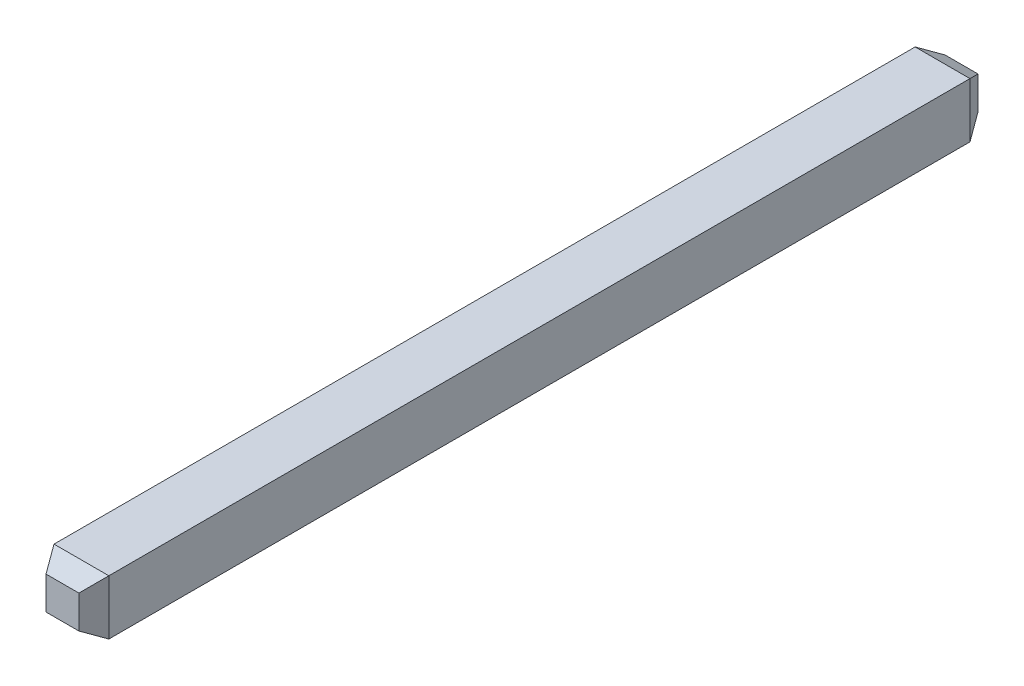
ISO-10303-21;
HEADER;
FILE_DESCRIPTION(('STEP AP214'),'2;1');
FILE_NAME('part.step','',(''),(''),'','','');
FILE_SCHEMA(('AUTOMOTIVE_DESIGN { 1 0 10303 214 1 1 1 1 }'));
ENDSEC;
DATA;
#1=APPLICATION_CONTEXT('core data for automotive mechanical design processes');
#2=APPLICATION_PROTOCOL_DEFINITION('international standard','automotive_design',2000,#1);
#3=PRODUCT_CONTEXT('',#1,'mechanical');
#4=PRODUCT('Part','Part','',(#3));
#5=PRODUCT_RELATED_PRODUCT_CATEGORY('part','',(#4));
#6=PRODUCT_DEFINITION_FORMATION('','',#4);
#7=PRODUCT_DEFINITION_CONTEXT('part definition',#1,'design');
#8=PRODUCT_DEFINITION('design','',#6,#7);
#9=PRODUCT_DEFINITION_SHAPE('','',#8);
#10=(LENGTH_UNIT() NAMED_UNIT(*) SI_UNIT(.MILLI.,.METRE.));
#11=(NAMED_UNIT(*) PLANE_ANGLE_UNIT() SI_UNIT($,.RADIAN.));
#12=(NAMED_UNIT(*) SI_UNIT($,.STERADIAN.) SOLID_ANGLE_UNIT());
#13=UNCERTAINTY_MEASURE_WITH_UNIT(LENGTH_MEASURE(1.E-05),#10,'distance_accuracy_value','');
#14=(GEOMETRIC_REPRESENTATION_CONTEXT(3) GLOBAL_UNCERTAINTY_ASSIGNED_CONTEXT((#13)) GLOBAL_UNIT_ASSIGNED_CONTEXT((#10,
#11,#12)) REPRESENTATION_CONTEXT('',''));
#15=CARTESIAN_POINT('',(0.,0.,0.));
#16=DIRECTION('',(0.,0.,1.));
#17=DIRECTION('',(1.,0.,0.));
#18=AXIS2_PLACEMENT_3D('',#15,#16,#17);
#19=CARTESIAN_POINT('',(0.,-0.2,0.08660254037844));
#20=DIRECTION('',(0.,-0.866025403784429,-0.500000000000017));
#21=DIRECTION('',(0.,0.500000000000017,-0.866025403784429));
#22=AXIS2_PLACEMENT_3D('',#19,#20,#21);
#23=PLANE('',#22);
#24=DIRECTION('',(-0.447213595499978,-0.447213595499939,0.774596669241483));
#25=VECTOR('',#24,1.);
#26=CARTESIAN_POINT('',(-0.15,-0.15,0.));
#27=LINE('',#26,#25);
#28=CARTESIAN_POINT('',(-0.15,-0.15,0.));
#29=VERTEX_POINT('',#28);
#30=CARTESIAN_POINT('',(-0.250000000000002,-0.250000000000004,0.173205080756896));
#31=VERTEX_POINT('',#30);
#32=EDGE_CURVE('E84',#29,#31,#27,.T.);
#33=ORIENTED_EDGE('',*,*,#32,.F.);
#34=DIRECTION('',(1.,0.,0.));
#35=VECTOR('',#34,1.);
#36=CARTESIAN_POINT('',(0.,-0.15,0.));
#37=LINE('',#36,#35);
#38=CARTESIAN_POINT('',(0.15,-0.15,0.));
#39=VERTEX_POINT('',#38);
#40=EDGE_CURVE('E78',#29,#39,#37,.T.);
#41=ORIENTED_EDGE('',*,*,#40,.T.);
#42=DIRECTION('',(-0.447213595499978,0.447213595499939,-0.774596669241483));
#43=VECTOR('',#42,1.);
#44=CARTESIAN_POINT('',(0.250000000000009,-0.25,0.173205080756895));
#45=LINE('',#44,#43);
#46=CARTESIAN_POINT('',(0.250000000000001,-0.250000000000004,0.173205080756897));
#47=VERTEX_POINT('',#46);
#48=EDGE_CURVE('E19',#47,#39,#45,.T.);
#49=ORIENTED_EDGE('',*,*,#48,.F.);
#50=DIRECTION('',(1.,0.,0.));
#51=VECTOR('',#50,1.);
#52=CARTESIAN_POINT('',(-0.25,-0.25,0.1732050807569));
#53=LINE('',#52,#51);
#54=EDGE_CURVE('E103',#31,#47,#53,.T.);
#55=ORIENTED_EDGE('',*,*,#54,.F.);
#56=EDGE_LOOP('',(#33,#41,#49,#55));
#57=FACE_BOUND('',#56,.T.);
#58=ADVANCED_FACE('F16',(#57),#23,.T.);
#59=CARTESIAN_POINT('',(0.,-0.2,8.113397459622));
#60=DIRECTION('',(0.,-0.866025403784429,0.500000000000017));
#61=DIRECTION('',(0.,-0.500000000000017,-0.866025403784429));
#62=AXIS2_PLACEMENT_3D('',#59,#60,#61);
#63=PLANE('',#62);
#64=DIRECTION('',(0.447213595500016,0.447213595499785,0.77459666924155));
#65=VECTOR('',#64,1.);
#66=CARTESIAN_POINT('',(-0.250000000000242,-0.25,8.02679491924314));
#67=LINE('',#66,#65);
#68=CARTESIAN_POINT('',(-0.25000000000003,-0.250000000000121,8.02679491924309));
#69=VERTEX_POINT('',#68);
#70=CARTESIAN_POINT('',(-0.150000000000095,-0.150000000000048,8.20000000000008));
#71=VERTEX_POINT('',#70);
#72=EDGE_CURVE('E111',#69,#71,#67,.T.);
#73=ORIENTED_EDGE('',*,*,#72,.F.);
#74=DIRECTION('',(1.,0.,0.));
#75=VECTOR('',#74,1.);
#76=CARTESIAN_POINT('',(-0.25,-0.25,8.026794919243));
#77=LINE('',#76,#75);
#78=CARTESIAN_POINT('',(0.25000000000003,-0.250000000000121,8.02679491924309));
#79=VERTEX_POINT('',#78);
#80=EDGE_CURVE('E105',#79,#69,#77,.F.);
#81=ORIENTED_EDGE('',*,*,#80,.F.);
#82=DIRECTION('',(0.447213595500016,-0.447213595499785,-0.77459666924155));
#83=VECTOR('',#82,1.);
#84=CARTESIAN_POINT('',(0.150000000000191,-0.15,8.20000000000011));
#85=LINE('',#84,#83);
#86=CARTESIAN_POINT('',(0.150000000000048,-0.150000000000095,8.20000000000008));
#87=VERTEX_POINT('',#86);
#88=EDGE_CURVE('E108',#87,#79,#85,.T.);
#89=ORIENTED_EDGE('',*,*,#88,.F.);
#90=DIRECTION('',(1.,0.,0.));
#91=VECTOR('',#90,1.);
#92=CARTESIAN_POINT('',(0.,-0.15,8.2));
#93=LINE('',#92,#91);
#94=EDGE_CURVE('E116',#71,#87,#93,.T.);
#95=ORIENTED_EDGE('',*,*,#94,.F.);
#96=EDGE_LOOP('',(#73,#81,#89,#95));
#97=FACE_BOUND('',#96,.T.);
#98=ADVANCED_FACE('F175',(#97),#63,.T.);
#99=CARTESIAN_POINT('',(0.2,0.,0.08660254037844));
#100=DIRECTION('',(0.866025403784429,0.,-0.500000000000017));
#101=DIRECTION('',(-0.500000000000017,0.,-0.866025403784429));
#102=AXIS2_PLACEMENT_3D('',#99,#100,#101);
#103=PLANE('',#102);
#104=ORIENTED_EDGE('',*,*,#48,.T.);
#105=DIRECTION('',(0.,1.,0.));
#106=VECTOR('',#105,1.);
#107=CARTESIAN_POINT('',(0.15,0.,0.));
#108=LINE('',#107,#106);
#109=CARTESIAN_POINT('',(0.15,0.15,0.));
#110=VERTEX_POINT('',#109);
#111=EDGE_CURVE('E86',#39,#110,#108,.T.);
#112=ORIENTED_EDGE('',*,*,#111,.T.);
#113=DIRECTION('',(-0.447213595499939,-0.447213595499978,-0.774596669241483));
#114=VECTOR('',#113,1.);
#115=CARTESIAN_POINT('',(0.25,0.250000000000009,0.173205080756895));
#116=LINE('',#115,#114);
#117=CARTESIAN_POINT('',(0.250000000000004,0.250000000000001,0.173205080756897));
#118=VERTEX_POINT('',#117);
#119=EDGE_CURVE('E128',#118,#110,#116,.T.);
#120=ORIENTED_EDGE('',*,*,#119,.F.);
#121=DIRECTION('',(0.,1.,0.));
#122=VECTOR('',#121,1.);
#123=CARTESIAN_POINT('',(0.25,-0.25,0.1732050807569));
#124=LINE('',#123,#122);
#125=EDGE_CURVE('E92',#47,#118,#124,.T.);
#126=ORIENTED_EDGE('',*,*,#125,.F.);
#127=EDGE_LOOP('',(#104,#112,#120,#126));
#128=FACE_BOUND('',#127,.T.);
#129=ADVANCED_FACE('F89',(#128),#103,.T.);
#130=CARTESIAN_POINT('',(0.,0.,0.));
#131=DIRECTION('',(0.,0.,1.));
#132=DIRECTION('',(1.,0.,0.));
#133=AXIS2_PLACEMENT_3D('',#130,#131,#132);
#134=PLANE('',#133);
#135=ORIENTED_EDGE('',*,*,#40,.F.);
#136=DIRECTION('',(0.,1.,0.));
#137=VECTOR('',#136,1.);
#138=CARTESIAN_POINT('',(-0.15,0.,0.));
#139=LINE('',#138,#137);
#140=CARTESIAN_POINT('',(-0.15,0.15,0.));
#141=VERTEX_POINT('',#140);
#142=EDGE_CURVE('E98',#141,#29,#139,.F.);
#143=ORIENTED_EDGE('',*,*,#142,.F.);
#144=DIRECTION('',(1.,0.,0.));
#145=VECTOR('',#144,1.);
#146=CARTESIAN_POINT('',(0.,0.15,0.));
#147=LINE('',#146,#145);
#148=EDGE_CURVE('E96',#110,#141,#147,.F.);
#149=ORIENTED_EDGE('',*,*,#148,.F.);
#150=ORIENTED_EDGE('',*,*,#111,.F.);
#151=EDGE_LOOP('',(#135,#143,#149,#150));
#152=FACE_BOUND('',#151,.T.);
#153=ADVANCED_FACE('F94',(#152),#134,.F.);
#154=CARTESIAN_POINT('',(-0.2,0.,0.08660254037844));
#155=DIRECTION('',(-0.866025403784429,0.,-0.500000000000017));
#156=DIRECTION('',(-0.500000000000017,0.,0.866025403784429));
#157=AXIS2_PLACEMENT_3D('',#154,#155,#156);
#158=PLANE('',#157);
#159=ORIENTED_EDGE('',*,*,#32,.T.);
#160=DIRECTION('',(0.,1.,0.));
#161=VECTOR('',#160,1.);
#162=CARTESIAN_POINT('',(-0.25,0.25,0.1732050807569));
#163=LINE('',#162,#161);
#164=CARTESIAN_POINT('',(-0.250000000000004,0.250000000000002,0.173205080756896));
#165=VERTEX_POINT('',#164);
#166=EDGE_CURVE('E134',#165,#31,#163,.F.);
#167=ORIENTED_EDGE('',*,*,#166,.F.);
#168=DIRECTION('',(-0.447213595499939,0.447213595499978,0.774596669241483));
#169=VECTOR('',#168,1.);
#170=CARTESIAN_POINT('',(-0.15,0.15,0.));
#171=LINE('',#170,#169);
#172=EDGE_CURVE('E131',#141,#165,#171,.T.);
#173=ORIENTED_EDGE('',*,*,#172,.F.);
#174=ORIENTED_EDGE('',*,*,#142,.T.);
#175=EDGE_LOOP('',(#159,#167,#173,#174));
#176=FACE_BOUND('',#175,.T.);
#177=ADVANCED_FACE('F183',(#176),#158,.T.);
#178=CARTESIAN_POINT('',(-0.25,-0.25,0.));
#179=DIRECTION('',(0.,-1.,0.));
#180=DIRECTION('',(0.,0.,-1.));
#181=AXIS2_PLACEMENT_3D('',#178,#179,#180);
#182=PLANE('',#181);
#183=DIRECTION('',(0.,0.,-1.));
#184=VECTOR('',#183,1.);
#185=CARTESIAN_POINT('',(0.25,-0.25,0.));
#186=LINE('',#185,#184);
#187=EDGE_CURVE('E122',#79,#47,#186,.T.);
#188=ORIENTED_EDGE('',*,*,#187,.F.);
#189=ORIENTED_EDGE('',*,*,#80,.T.);
#190=DIRECTION('',(0.,0.,1.));
#191=VECTOR('',#190,1.);
#192=CARTESIAN_POINT('',(-0.25,-0.25,0.));
#193=LINE('',#192,#191);
#194=EDGE_CURVE('E137',#31,#69,#193,.T.);
#195=ORIENTED_EDGE('',*,*,#194,.F.);
#196=ORIENTED_EDGE('',*,*,#54,.T.);
#197=EDGE_LOOP('',(#188,#189,#195,#196));
#198=FACE_BOUND('',#197,.T.);
#199=ADVANCED_FACE('F185',(#198),#182,.T.);
#200=CARTESIAN_POINT('',(0.2,0.,8.113397459622));
#201=DIRECTION('',(0.866025403784429,0.,0.500000000000017));
#202=DIRECTION('',(0.500000000000017,0.,-0.866025403784429));
#203=AXIS2_PLACEMENT_3D('',#200,#201,#202);
#204=PLANE('',#203);
#205=ORIENTED_EDGE('',*,*,#88,.T.);
#206=DIRECTION('',(0.,1.,0.));
#207=VECTOR('',#206,1.);
#208=CARTESIAN_POINT('',(0.25,-0.25,8.026794919243));
#209=LINE('',#208,#207);
#210=CARTESIAN_POINT('',(0.250000000000121,0.25000000000003,8.02679491924309));
#211=VERTEX_POINT('',#210);
#212=EDGE_CURVE('E125',#211,#79,#209,.F.);
#213=ORIENTED_EDGE('',*,*,#212,.F.);
#214=DIRECTION('',(0.447213595499785,0.447213595500016,-0.77459666924155));
#215=VECTOR('',#214,1.);
#216=CARTESIAN_POINT('',(0.15,0.150000000000191,8.20000000000011));
#217=LINE('',#216,#215);
#218=CARTESIAN_POINT('',(0.150000000000095,0.150000000000048,8.20000000000008));
#219=VERTEX_POINT('',#218);
#220=EDGE_CURVE('E142',#219,#211,#217,.T.);
#221=ORIENTED_EDGE('',*,*,#220,.F.);
#222=DIRECTION('',(0.,1.,0.));
#223=VECTOR('',#222,1.);
#224=CARTESIAN_POINT('',(0.15,0.,8.2));
#225=LINE('',#224,#223);
#226=EDGE_CURVE('E119',#87,#219,#225,.T.);
#227=ORIENTED_EDGE('',*,*,#226,.F.);
#228=EDGE_LOOP('',(#205,#213,#221,#227));
#229=FACE_BOUND('',#228,.T.);
#230=ADVANCED_FACE('F169',(#229),#204,.T.);
#231=CARTESIAN_POINT('',(-0.2,0.,8.113397459622));
#232=DIRECTION('',(-0.866025403784429,0.,0.500000000000017));
#233=DIRECTION('',(0.500000000000017,0.,0.866025403784429));
#234=AXIS2_PLACEMENT_3D('',#231,#232,#233);
#235=PLANE('',#234);
#236=DIRECTION('',(0.447213595499785,-0.447213595500016,0.77459666924155));
#237=VECTOR('',#236,1.);
#238=CARTESIAN_POINT('',(-0.25,0.250000000000242,8.02679491924314));
#239=LINE('',#238,#237);
#240=CARTESIAN_POINT('',(-0.250000000000121,0.25000000000003,8.02679491924309));
#241=VERTEX_POINT('',#240);
#242=CARTESIAN_POINT('',(-0.150000000000095,0.150000000000048,8.20000000000008));
#243=VERTEX_POINT('',#242);
#244=EDGE_CURVE('E34',#241,#243,#239,.T.);
#245=ORIENTED_EDGE('',*,*,#244,.F.);
#246=DIRECTION('',(0.,1.,0.));
#247=VECTOR('',#246,1.);
#248=CARTESIAN_POINT('',(-0.25,0.25,8.026794919243));
#249=LINE('',#248,#247);
#250=EDGE_CURVE('E140',#69,#241,#249,.T.);
#251=ORIENTED_EDGE('',*,*,#250,.F.);
#252=ORIENTED_EDGE('',*,*,#72,.T.);
#253=DIRECTION('',(0.,1.,0.));
#254=VECTOR('',#253,1.);
#255=CARTESIAN_POINT('',(-0.15,0.,8.2));
#256=LINE('',#255,#254);
#257=EDGE_CURVE('E113',#243,#71,#256,.F.);
#258=ORIENTED_EDGE('',*,*,#257,.F.);
#259=EDGE_LOOP('',(#245,#251,#252,#258));
#260=FACE_BOUND('',#259,.T.);
#261=ADVANCED_FACE('F193',(#260),#235,.T.);
#262=CARTESIAN_POINT('',(0.,0.,8.2));
#263=DIRECTION('',(0.,0.,1.));
#264=DIRECTION('',(1.,0.,0.));
#265=AXIS2_PLACEMENT_3D('',#262,#263,#264);
#266=PLANE('',#265);
#267=ORIENTED_EDGE('',*,*,#226,.T.);
#268=DIRECTION('',(1.,0.,0.));
#269=VECTOR('',#268,1.);
#270=CARTESIAN_POINT('',(0.,0.150000000000191,8.20000000000011));
#271=LINE('',#270,#269);
#272=EDGE_CURVE('E146',#243,#219,#271,.T.);
#273=ORIENTED_EDGE('',*,*,#272,.F.);
#274=ORIENTED_EDGE('',*,*,#257,.T.);
#275=ORIENTED_EDGE('',*,*,#94,.T.);
#276=EDGE_LOOP('',(#267,#273,#274,#275));
#277=FACE_BOUND('',#276,.T.);
#278=ADVANCED_FACE('F172',(#277),#266,.T.);
#279=CARTESIAN_POINT('',(0.25,-0.25,0.));
#280=DIRECTION('',(1.,0.,0.));
#281=DIRECTION('',(0.,0.,-1.));
#282=AXIS2_PLACEMENT_3D('',#279,#280,#281);
#283=PLANE('',#282);
#284=DIRECTION('',(0.,0.,1.));
#285=VECTOR('',#284,1.);
#286=CARTESIAN_POINT('',(0.25,0.25,0.));
#287=LINE('',#286,#285);
#288=EDGE_CURVE('E149',#211,#118,#287,.F.);
#289=ORIENTED_EDGE('',*,*,#288,.F.);
#290=ORIENTED_EDGE('',*,*,#212,.T.);
#291=ORIENTED_EDGE('',*,*,#187,.T.);
#292=ORIENTED_EDGE('',*,*,#125,.T.);
#293=EDGE_LOOP('',(#289,#290,#291,#292));
#294=FACE_BOUND('',#293,.T.);
#295=ADVANCED_FACE('F178',(#294),#283,.T.);
#296=CARTESIAN_POINT('',(0.,0.2,0.08660254037844));
#297=DIRECTION('',(0.,0.866025403784429,-0.500000000000017));
#298=DIRECTION('',(0.,0.500000000000017,0.866025403784429));
#299=AXIS2_PLACEMENT_3D('',#296,#297,#298);
#300=PLANE('',#299);
#301=ORIENTED_EDGE('',*,*,#172,.T.);
#302=DIRECTION('',(1.,0.,0.));
#303=VECTOR('',#302,1.);
#304=CARTESIAN_POINT('',(0.25,0.25,0.1732050807569));
#305=LINE('',#304,#303);
#306=EDGE_CURVE('E152',#118,#165,#305,.F.);
#307=ORIENTED_EDGE('',*,*,#306,.F.);
#308=ORIENTED_EDGE('',*,*,#119,.T.);
#309=ORIENTED_EDGE('',*,*,#148,.T.);
#310=EDGE_LOOP('',(#301,#307,#308,#309));
#311=FACE_BOUND('',#310,.T.);
#312=ADVANCED_FACE('F180',(#311),#300,.T.);
#313=CARTESIAN_POINT('',(-0.25,0.25,0.));
#314=DIRECTION('',(-1.,0.,0.));
#315=DIRECTION('',(0.,0.,1.));
#316=AXIS2_PLACEMENT_3D('',#313,#314,#315);
#317=PLANE('',#316);
#318=ORIENTED_EDGE('',*,*,#194,.T.);
#319=ORIENTED_EDGE('',*,*,#250,.T.);
#320=DIRECTION('',(0.,0.,1.));
#321=VECTOR('',#320,1.);
#322=CARTESIAN_POINT('',(-0.25,0.25,0.));
#323=LINE('',#322,#321);
#324=EDGE_CURVE('E25',#165,#241,#323,.T.);
#325=ORIENTED_EDGE('',*,*,#324,.F.);
#326=ORIENTED_EDGE('',*,*,#166,.T.);
#327=EDGE_LOOP('',(#318,#319,#325,#326));
#328=FACE_BOUND('',#327,.T.);
#329=ADVANCED_FACE('F162',(#328),#317,.T.);
#330=CARTESIAN_POINT('',(0.,0.2,8.113397459622));
#331=DIRECTION('',(0.,0.866025403784429,0.500000000000017));
#332=DIRECTION('',(0.,-0.500000000000017,0.866025403784429));
#333=AXIS2_PLACEMENT_3D('',#330,#331,#332);
#334=PLANE('',#333);
#335=ORIENTED_EDGE('',*,*,#244,.T.);
#336=ORIENTED_EDGE('',*,*,#272,.T.);
#337=ORIENTED_EDGE('',*,*,#220,.T.);
#338=DIRECTION('',(1.,0.,0.));
#339=VECTOR('',#338,1.);
#340=CARTESIAN_POINT('',(0.25,0.25,8.026794919243));
#341=LINE('',#340,#339);
#342=EDGE_CURVE('E10',#241,#211,#341,.T.);
#343=ORIENTED_EDGE('',*,*,#342,.F.);
#344=EDGE_LOOP('',(#335,#336,#337,#343));
#345=FACE_BOUND('',#344,.T.);
#346=ADVANCED_FACE('F165',(#345),#334,.T.);
#347=CARTESIAN_POINT('',(0.25,0.25,0.));
#348=DIRECTION('',(0.,1.,0.));
#349=DIRECTION('',(0.,0.,1.));
#350=AXIS2_PLACEMENT_3D('',#347,#348,#349);
#351=PLANE('',#350);
#352=ORIENTED_EDGE('',*,*,#324,.T.);
#353=ORIENTED_EDGE('',*,*,#342,.T.);
#354=ORIENTED_EDGE('',*,*,#288,.T.);
#355=ORIENTED_EDGE('',*,*,#306,.T.);
#356=EDGE_LOOP('',(#352,#353,#354,#355));
#357=FACE_BOUND('',#356,.T.);
#358=ADVANCED_FACE('F158',(#357),#351,.T.);
#359=CLOSED_SHELL('',(#58,#98,#129,#153,#177,#199,#230,#261,#278,#295,#312,#329,#346,#358));
#360=MANIFOLD_SOLID_BREP('B1',#359);
#361=ADVANCED_BREP_SHAPE_REPRESENTATION('',(#18,#360),#14);
#362=SHAPE_DEFINITION_REPRESENTATION(#9,#361);
ENDSEC;
END-ISO-10303-21;
